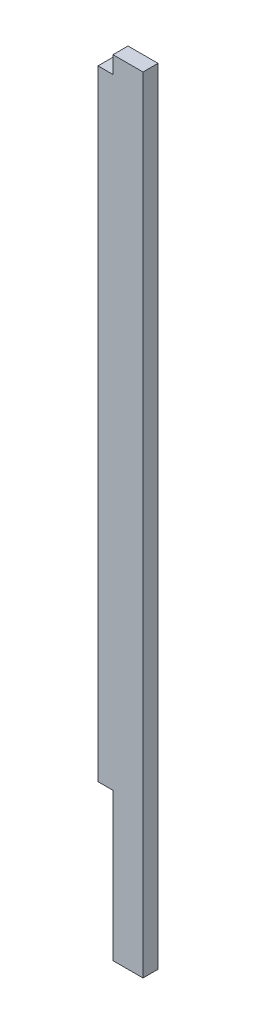
ISO-10303-21;
HEADER;
FILE_DESCRIPTION(('STEP AP214'),'2;1');
FILE_NAME('part.step','',(''),(''),'','','');
FILE_SCHEMA(('AUTOMOTIVE_DESIGN { 1 0 10303 214 1 1 1 1 }'));
ENDSEC;
DATA;
#1=APPLICATION_CONTEXT('core data for automotive mechanical design processes');
#2=APPLICATION_PROTOCOL_DEFINITION('international standard','automotive_design',2000,#1);
#3=PRODUCT_CONTEXT('',#1,'mechanical');
#4=PRODUCT('Part','Part','',(#3));
#5=PRODUCT_RELATED_PRODUCT_CATEGORY('part','',(#4));
#6=PRODUCT_DEFINITION_FORMATION('','',#4);
#7=PRODUCT_DEFINITION_CONTEXT('part definition',#1,'design');
#8=PRODUCT_DEFINITION('design','',#6,#7);
#9=PRODUCT_DEFINITION_SHAPE('','',#8);
#10=(LENGTH_UNIT() NAMED_UNIT(*) SI_UNIT(.MILLI.,.METRE.));
#11=(NAMED_UNIT(*) PLANE_ANGLE_UNIT() SI_UNIT($,.RADIAN.));
#12=(NAMED_UNIT(*) SI_UNIT($,.STERADIAN.) SOLID_ANGLE_UNIT());
#13=UNCERTAINTY_MEASURE_WITH_UNIT(LENGTH_MEASURE(1.E-05),#10,'distance_accuracy_value','');
#14=(GEOMETRIC_REPRESENTATION_CONTEXT(3) GLOBAL_UNCERTAINTY_ASSIGNED_CONTEXT((#13)) GLOBAL_UNIT_ASSIGNED_CONTEXT((#10,
#11,#12)) REPRESENTATION_CONTEXT('',''));
#15=CARTESIAN_POINT('',(0.,0.,0.));
#16=DIRECTION('',(0.,0.,1.));
#17=DIRECTION('',(1.,0.,0.));
#18=AXIS2_PLACEMENT_3D('',#15,#16,#17);
#19=CARTESIAN_POINT('',(-8.11530000000002,0.,5.4102));
#20=DIRECTION('',(-1.,0.,0.));
#21=DIRECTION('',(0.,-1.,0.));
#22=AXIS2_PLACEMENT_3D('',#19,#20,#21);
#23=PLANE('',#22);
#24=DIRECTION('',(0.,1.,0.));
#25=VECTOR('',#24,1.);
#26=CARTESIAN_POINT('',(-8.11530000000002,0.,0.));
#27=LINE('',#26,#25);
#28=CARTESIAN_POINT('',(-8.1153,-108.6104,0.));
#29=VERTEX_POINT('',#28);
#30=CARTESIAN_POINT('',(-8.11530000000003,114.9604,0.));
#31=VERTEX_POINT('',#30);
#32=EDGE_CURVE('E123',#29,#31,#27,.T.);
#33=ORIENTED_EDGE('',*,*,#32,.F.);
#34=DIRECTION('',(0.,0.,-1.));
#35=VECTOR('',#34,1.);
#36=CARTESIAN_POINT('',(-8.1153,-108.6104,5.4102));
#37=LINE('',#36,#35);
#38=CARTESIAN_POINT('',(-8.1153,-108.6104,5.4102));
#39=VERTEX_POINT('',#38);
#40=EDGE_CURVE('E11',#39,#29,#37,.T.);
#41=ORIENTED_EDGE('',*,*,#40,.F.);
#42=DIRECTION('',(0.,1.,0.));
#43=VECTOR('',#42,1.);
#44=CARTESIAN_POINT('',(-8.11530000000002,0.,5.4102));
#45=LINE('',#44,#43);
#46=CARTESIAN_POINT('',(-8.11530000000003,114.9604,5.4102));
#47=VERTEX_POINT('',#46);
#48=EDGE_CURVE('E141',#39,#47,#45,.T.);
#49=ORIENTED_EDGE('',*,*,#48,.T.);
#50=DIRECTION('',(0.,0.,-1.));
#51=VECTOR('',#50,1.);
#52=CARTESIAN_POINT('',(-8.11530000000003,114.9604,5.4102));
#53=LINE('',#52,#51);
#54=EDGE_CURVE('E51',#47,#31,#53,.T.);
#55=ORIENTED_EDGE('',*,*,#54,.T.);
#56=EDGE_LOOP('',(#33,#41,#49,#55));
#57=FACE_BOUND('',#56,.T.);
#58=ADVANCED_FACE('F35',(#57),#23,.T.);
#59=CARTESIAN_POINT('',(0.,-108.6104,5.4102));
#60=DIRECTION('',(0.,1.,0.));
#61=DIRECTION('',(0.,0.,1.));
#62=AXIS2_PLACEMENT_3D('',#59,#60,#61);
#63=PLANE('',#62);
#64=DIRECTION('',(1.,0.,0.));
#65=VECTOR('',#64,1.);
#66=CARTESIAN_POINT('',(0.,-108.6104,0.));
#67=LINE('',#66,#65);
#68=CARTESIAN_POINT('',(-2.70509999999997,-108.6104,0.));
#69=VERTEX_POINT('',#68);
#70=EDGE_CURVE('E125',#29,#69,#67,.T.);
#71=ORIENTED_EDGE('',*,*,#70,.T.);
#72=DIRECTION('',(0.,0.,-1.));
#73=VECTOR('',#72,1.);
#74=CARTESIAN_POINT('',(-2.70509999999997,-108.6104,5.4102));
#75=LINE('',#74,#73);
#76=CARTESIAN_POINT('',(-2.70509999999997,-108.6104,5.4102));
#77=VERTEX_POINT('',#76);
#78=EDGE_CURVE('E43',#77,#69,#75,.T.);
#79=ORIENTED_EDGE('',*,*,#78,.F.);
#80=DIRECTION('',(1.,0.,0.));
#81=VECTOR('',#80,1.);
#82=CARTESIAN_POINT('',(0.,-108.6104,5.4102));
#83=LINE('',#82,#81);
#84=EDGE_CURVE('E174',#39,#77,#83,.T.);
#85=ORIENTED_EDGE('',*,*,#84,.F.);
#86=ORIENTED_EDGE('',*,*,#40,.T.);
#87=EDGE_LOOP('',(#71,#79,#85,#86));
#88=FACE_BOUND('',#87,.T.);
#89=ADVANCED_FACE('F155',(#88),#63,.F.);
#90=CARTESIAN_POINT('',(-2.70509999999999,0.,5.4102));
#91=DIRECTION('',(-1.,0.,0.));
#92=DIRECTION('',(0.,-1.,0.));
#93=AXIS2_PLACEMENT_3D('',#90,#91,#92);
#94=PLANE('',#93);
#95=DIRECTION('',(0.,1.,0.));
#96=VECTOR('',#95,1.);
#97=CARTESIAN_POINT('',(-2.70509999999999,0.,0.));
#98=LINE('',#97,#96);
#99=CARTESIAN_POINT('',(-2.70509999999997,-161.798,0.));
#100=VERTEX_POINT('',#99);
#101=EDGE_CURVE('E129',#100,#69,#98,.T.);
#102=ORIENTED_EDGE('',*,*,#101,.F.);
#103=DIRECTION('',(0.,0.,1.));
#104=VECTOR('',#103,1.);
#105=CARTESIAN_POINT('',(-2.70509999999997,-161.798,0.));
#106=LINE('',#105,#104);
#107=CARTESIAN_POINT('',(-2.70509999999997,-161.798,5.4102));
#108=VERTEX_POINT('',#107);
#109=EDGE_CURVE('E166',#100,#108,#106,.T.);
#110=ORIENTED_EDGE('',*,*,#109,.T.);
#111=DIRECTION('',(0.,1.,0.));
#112=VECTOR('',#111,1.);
#113=CARTESIAN_POINT('',(-2.70509999999999,0.,5.4102));
#114=LINE('',#113,#112);
#115=EDGE_CURVE('E118',#108,#77,#114,.T.);
#116=ORIENTED_EDGE('',*,*,#115,.T.);
#117=ORIENTED_EDGE('',*,*,#78,.T.);
#118=EDGE_LOOP('',(#102,#110,#116,#117));
#119=FACE_BOUND('',#118,.T.);
#120=ADVANCED_FACE('F148',(#119),#94,.T.);
#121=CARTESIAN_POINT('',(8.11529999999999,0.,5.4102));
#122=DIRECTION('',(-1.,0.,0.));
#123=DIRECTION('',(0.,-1.,0.));
#124=AXIS2_PLACEMENT_3D('',#121,#122,#123);
#125=PLANE('',#124);
#126=DIRECTION('',(0.,1.,0.));
#127=VECTOR('',#126,1.);
#128=CARTESIAN_POINT('',(8.11529999999999,0.,0.));
#129=LINE('',#128,#127);
#130=CARTESIAN_POINT('',(8.11529999999999,-161.798,0.));
#131=VERTEX_POINT('',#130);
#132=CARTESIAN_POINT('',(8.11529999999997,121.158,0.));
#133=VERTEX_POINT('',#132);
#134=EDGE_CURVE('E132',#131,#133,#129,.T.);
#135=ORIENTED_EDGE('',*,*,#134,.T.);
#136=DIRECTION('',(0.,0.,-1.));
#137=VECTOR('',#136,1.);
#138=CARTESIAN_POINT('',(8.11529999999997,121.158,5.4102));
#139=LINE('',#138,#137);
#140=CARTESIAN_POINT('',(8.11529999999997,121.158,5.4102));
#141=VERTEX_POINT('',#140);
#142=EDGE_CURVE('E103',#141,#133,#139,.T.);
#143=ORIENTED_EDGE('',*,*,#142,.F.);
#144=DIRECTION('',(0.,1.,0.));
#145=VECTOR('',#144,1.);
#146=CARTESIAN_POINT('',(8.11529999999999,0.,5.4102));
#147=LINE('',#146,#145);
#148=CARTESIAN_POINT('',(8.11529999999999,-161.798,5.4102));
#149=VERTEX_POINT('',#148);
#150=EDGE_CURVE('E115',#149,#141,#147,.T.);
#151=ORIENTED_EDGE('',*,*,#150,.F.);
#152=DIRECTION('',(0.,0.,1.));
#153=VECTOR('',#152,1.);
#154=CARTESIAN_POINT('',(8.11529999999999,-161.798,0.));
#155=LINE('',#154,#153);
#156=EDGE_CURVE('E126',#131,#149,#155,.T.);
#157=ORIENTED_EDGE('',*,*,#156,.F.);
#158=EDGE_LOOP('',(#135,#143,#151,#157));
#159=FACE_BOUND('',#158,.T.);
#160=ADVANCED_FACE('F183',(#159),#125,.F.);
#161=CARTESIAN_POINT('',(0.,121.158,5.4102));
#162=DIRECTION('',(0.,1.,0.));
#163=DIRECTION('',(0.,0.,1.));
#164=AXIS2_PLACEMENT_3D('',#161,#162,#163);
#165=PLANE('',#164);
#166=DIRECTION('',(1.,0.,0.));
#167=VECTOR('',#166,1.);
#168=CARTESIAN_POINT('',(0.,121.158,0.));
#169=LINE('',#168,#167);
#170=CARTESIAN_POINT('',(-2.7051,121.158,0.));
#171=VERTEX_POINT('',#170);
#172=EDGE_CURVE('E100',#171,#133,#169,.T.);
#173=ORIENTED_EDGE('',*,*,#172,.F.);
#174=DIRECTION('',(0.,0.,-1.));
#175=VECTOR('',#174,1.);
#176=CARTESIAN_POINT('',(-2.7051,121.158,5.4102));
#177=LINE('',#176,#175);
#178=CARTESIAN_POINT('',(-2.7051,121.158,5.4102));
#179=VERTEX_POINT('',#178);
#180=EDGE_CURVE('E94',#179,#171,#177,.T.);
#181=ORIENTED_EDGE('',*,*,#180,.F.);
#182=DIRECTION('',(1.,0.,0.));
#183=VECTOR('',#182,1.);
#184=CARTESIAN_POINT('',(0.,121.158,5.4102));
#185=LINE('',#184,#183);
#186=EDGE_CURVE('E98',#179,#141,#185,.T.);
#187=ORIENTED_EDGE('',*,*,#186,.T.);
#188=ORIENTED_EDGE('',*,*,#142,.T.);
#189=EDGE_LOOP('',(#173,#181,#187,#188));
#190=FACE_BOUND('',#189,.T.);
#191=ADVANCED_FACE('F96',(#190),#165,.T.);
#192=CARTESIAN_POINT('',(-2.70509999999999,0.,5.4102));
#193=DIRECTION('',(1.,0.,0.));
#194=DIRECTION('',(0.,1.,0.));
#195=AXIS2_PLACEMENT_3D('',#192,#193,#194);
#196=PLANE('',#195);
#197=DIRECTION('',(0.,-1.,0.));
#198=VECTOR('',#197,1.);
#199=CARTESIAN_POINT('',(-2.70509999999999,0.,0.));
#200=LINE('',#199,#198);
#201=CARTESIAN_POINT('',(-2.7051,114.9604,0.));
#202=VERTEX_POINT('',#201);
#203=EDGE_CURVE('E136',#171,#202,#200,.T.);
#204=ORIENTED_EDGE('',*,*,#203,.T.);
#205=DIRECTION('',(0.,0.,-1.));
#206=VECTOR('',#205,1.);
#207=CARTESIAN_POINT('',(-2.7051,114.9604,5.4102));
#208=LINE('',#207,#206);
#209=CARTESIAN_POINT('',(-2.7051,114.9604,5.4102));
#210=VERTEX_POINT('',#209);
#211=EDGE_CURVE('E72',#210,#202,#208,.T.);
#212=ORIENTED_EDGE('',*,*,#211,.F.);
#213=DIRECTION('',(0.,-1.,0.));
#214=VECTOR('',#213,1.);
#215=CARTESIAN_POINT('',(-2.70509999999999,0.,5.4102));
#216=LINE('',#215,#214);
#217=EDGE_CURVE('E105',#179,#210,#216,.T.);
#218=ORIENTED_EDGE('',*,*,#217,.F.);
#219=ORIENTED_EDGE('',*,*,#180,.T.);
#220=EDGE_LOOP('',(#204,#212,#218,#219));
#221=FACE_BOUND('',#220,.T.);
#222=ADVANCED_FACE('F106',(#221),#196,.F.);
#223=CARTESIAN_POINT('',(0.,114.9604,5.4102));
#224=DIRECTION('',(0.,1.,0.));
#225=DIRECTION('',(0.,0.,1.));
#226=AXIS2_PLACEMENT_3D('',#223,#224,#225);
#227=PLANE('',#226);
#228=DIRECTION('',(1.,0.,0.));
#229=VECTOR('',#228,1.);
#230=CARTESIAN_POINT('',(0.,114.9604,0.));
#231=LINE('',#230,#229);
#232=EDGE_CURVE('E138',#31,#202,#231,.T.);
#233=ORIENTED_EDGE('',*,*,#232,.F.);
#234=ORIENTED_EDGE('',*,*,#54,.F.);
#235=DIRECTION('',(1.,0.,0.));
#236=VECTOR('',#235,1.);
#237=CARTESIAN_POINT('',(0.,114.9604,5.4102));
#238=LINE('',#237,#236);
#239=EDGE_CURVE('E109',#47,#210,#238,.T.);
#240=ORIENTED_EDGE('',*,*,#239,.T.);
#241=ORIENTED_EDGE('',*,*,#211,.T.);
#242=EDGE_LOOP('',(#233,#234,#240,#241));
#243=FACE_BOUND('',#242,.T.);
#244=ADVANCED_FACE('F193',(#243),#227,.T.);
#245=CARTESIAN_POINT('',(0.,0.,5.4102));
#246=DIRECTION('',(0.,0.,1.));
#247=DIRECTION('',(1.,0.,0.));
#248=AXIS2_PLACEMENT_3D('',#245,#246,#247);
#249=PLANE('',#248);
#250=ORIENTED_EDGE('',*,*,#48,.F.);
#251=ORIENTED_EDGE('',*,*,#84,.T.);
#252=ORIENTED_EDGE('',*,*,#115,.F.);
#253=DIRECTION('',(1.,0.,0.));
#254=VECTOR('',#253,1.);
#255=CARTESIAN_POINT('',(-2.70509999999997,-161.798,5.4102));
#256=LINE('',#255,#254);
#257=EDGE_CURVE('E167',#108,#149,#256,.T.);
#258=ORIENTED_EDGE('',*,*,#257,.T.);
#259=ORIENTED_EDGE('',*,*,#150,.T.);
#260=ORIENTED_EDGE('',*,*,#186,.F.);
#261=ORIENTED_EDGE('',*,*,#217,.T.);
#262=ORIENTED_EDGE('',*,*,#239,.F.);
#263=EDGE_LOOP('',(#250,#251,#252,#258,#259,#260,#261,#262));
#264=FACE_BOUND('',#263,.T.);
#265=ADVANCED_FACE('F112',(#264),#249,.T.);
#266=CARTESIAN_POINT('',(0.,0.,0.));
#267=DIRECTION('',(0.,0.,1.));
#268=DIRECTION('',(1.,0.,0.));
#269=AXIS2_PLACEMENT_3D('',#266,#267,#268);
#270=PLANE('',#269);
#271=ORIENTED_EDGE('',*,*,#32,.T.);
#272=ORIENTED_EDGE('',*,*,#232,.T.);
#273=ORIENTED_EDGE('',*,*,#203,.F.);
#274=ORIENTED_EDGE('',*,*,#172,.T.);
#275=ORIENTED_EDGE('',*,*,#134,.F.);
#276=DIRECTION('',(1.,0.,0.));
#277=VECTOR('',#276,1.);
#278=CARTESIAN_POINT('',(-2.70509999999997,-161.798,0.));
#279=LINE('',#278,#277);
#280=EDGE_CURVE('E161',#100,#131,#279,.T.);
#281=ORIENTED_EDGE('',*,*,#280,.F.);
#282=ORIENTED_EDGE('',*,*,#101,.T.);
#283=ORIENTED_EDGE('',*,*,#70,.F.);
#284=EDGE_LOOP('',(#271,#272,#273,#274,#275,#281,#282,#283));
#285=FACE_BOUND('',#284,.T.);
#286=ADVANCED_FACE('F158',(#285),#270,.F.);
#287=CARTESIAN_POINT('',(-2.70509999999997,-161.798,0.));
#288=DIRECTION('',(0.,-1.,0.));
#289=DIRECTION('',(0.,0.,-1.));
#290=AXIS2_PLACEMENT_3D('',#287,#288,#289);
#291=PLANE('',#290);
#292=ORIENTED_EDGE('',*,*,#257,.F.);
#293=ORIENTED_EDGE('',*,*,#109,.F.);
#294=ORIENTED_EDGE('',*,*,#280,.T.);
#295=ORIENTED_EDGE('',*,*,#156,.T.);
#296=EDGE_LOOP('',(#292,#293,#294,#295));
#297=FACE_BOUND('',#296,.T.);
#298=ADVANCED_FACE('F198',(#297),#291,.T.);
#299=CLOSED_SHELL('',(#58,#89,#120,#160,#191,#222,#244,#265,#286,#298));
#300=MANIFOLD_SOLID_BREP('B2',#299);
#301=ADVANCED_BREP_SHAPE_REPRESENTATION('',(#18,#300),#14);
#302=SHAPE_DEFINITION_REPRESENTATION(#9,#301);
ENDSEC;
END-ISO-10303-21;
